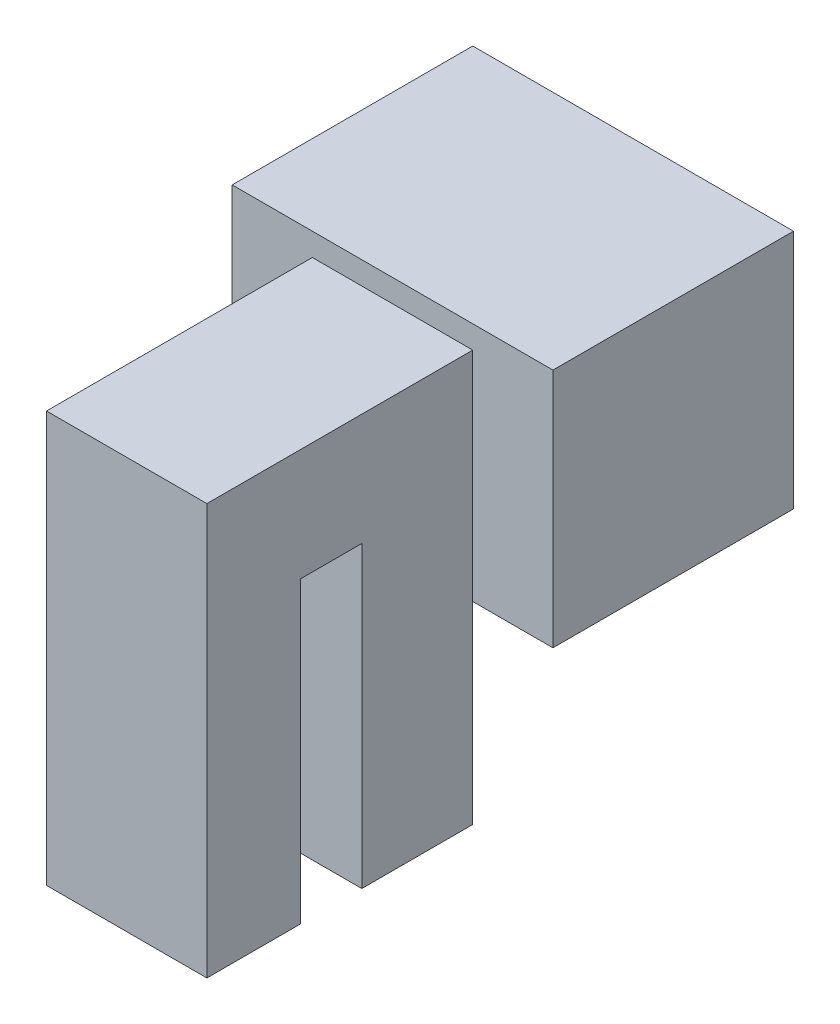
ISO-10303-21;
HEADER;
FILE_DESCRIPTION(('STEP AP214'),'2;1');
FILE_NAME('part.step','',(''),(''),'','','');
FILE_SCHEMA(('AUTOMOTIVE_DESIGN { 1 0 10303 214 1 1 1 1 }'));
ENDSEC;
DATA;
#1=APPLICATION_CONTEXT('core data for automotive mechanical design processes');
#2=APPLICATION_PROTOCOL_DEFINITION('international standard','automotive_design',2000,#1);
#3=PRODUCT_CONTEXT('',#1,'mechanical');
#4=PRODUCT('Part','Part','',(#3));
#5=PRODUCT_RELATED_PRODUCT_CATEGORY('part','',(#4));
#6=PRODUCT_DEFINITION_FORMATION('','',#4);
#7=PRODUCT_DEFINITION_CONTEXT('part definition',#1,'design');
#8=PRODUCT_DEFINITION('design','',#6,#7);
#9=PRODUCT_DEFINITION_SHAPE('','',#8);
#10=(LENGTH_UNIT() NAMED_UNIT(*) SI_UNIT(.MILLI.,.METRE.));
#11=(NAMED_UNIT(*) PLANE_ANGLE_UNIT() SI_UNIT($,.RADIAN.));
#12=(NAMED_UNIT(*) SI_UNIT($,.STERADIAN.) SOLID_ANGLE_UNIT());
#13=UNCERTAINTY_MEASURE_WITH_UNIT(LENGTH_MEASURE(1.E-05),#10,'distance_accuracy_value','');
#14=(GEOMETRIC_REPRESENTATION_CONTEXT(3) GLOBAL_UNCERTAINTY_ASSIGNED_CONTEXT((#13)) GLOBAL_UNIT_ASSIGNED_CONTEXT((#10,
#11,#12)) REPRESENTATION_CONTEXT('',''));
#15=CARTESIAN_POINT('',(0.,0.,0.));
#16=DIRECTION('',(0.,0.,1.));
#17=DIRECTION('',(1.,0.,0.));
#18=AXIS2_PLACEMENT_3D('',#15,#16,#17);
#19=CARTESIAN_POINT('',(0.,0.,30.));
#20=DIRECTION('',(-1.,0.,0.));
#21=DIRECTION('',(0.,-1.,0.));
#22=AXIS2_PLACEMENT_3D('',#19,#20,#21);
#23=PLANE('',#22);
#24=DIRECTION('',(0.,1.,0.));
#25=VECTOR('',#24,1.);
#26=CARTESIAN_POINT('',(0.,0.,0.));
#27=LINE('',#26,#25);
#28=CARTESIAN_POINT('',(0.,0.,0.));
#29=VERTEX_POINT('',#28);
#30=CARTESIAN_POINT('',(0.,30.,0.));
#31=VERTEX_POINT('',#30);
#32=EDGE_CURVE('E200',#29,#31,#27,.T.);
#33=ORIENTED_EDGE('',*,*,#32,.T.);
#34=DIRECTION('',(0.,0.,-1.));
#35=VECTOR('',#34,1.);
#36=CARTESIAN_POINT('',(0.,30.,30.));
#37=LINE('',#36,#35);
#38=CARTESIAN_POINT('',(0.,30.,30.));
#39=VERTEX_POINT('',#38);
#40=EDGE_CURVE('E11',#39,#31,#37,.T.);
#41=ORIENTED_EDGE('',*,*,#40,.F.);
#42=DIRECTION('',(0.,1.,0.));
#43=VECTOR('',#42,1.);
#44=CARTESIAN_POINT('',(0.,0.,30.));
#45=LINE('',#44,#43);
#46=CARTESIAN_POINT('',(0.,0.,30.));
#47=VERTEX_POINT('',#46);
#48=EDGE_CURVE('E212',#47,#39,#45,.T.);
#49=ORIENTED_EDGE('',*,*,#48,.F.);
#50=DIRECTION('',(0.,0.,-1.));
#51=VECTOR('',#50,1.);
#52=CARTESIAN_POINT('',(0.,0.,30.));
#53=LINE('',#52,#51);
#54=EDGE_CURVE('E220',#47,#29,#53,.T.);
#55=ORIENTED_EDGE('',*,*,#54,.T.);
#56=EDGE_LOOP('',(#33,#41,#49,#55));
#57=FACE_BOUND('',#56,.T.);
#58=ADVANCED_FACE('F33',(#57),#23,.F.);
#59=CARTESIAN_POINT('',(0.,30.,30.));
#60=DIRECTION('',(0.,-1.,0.));
#61=DIRECTION('',(1.,0.,0.));
#62=AXIS2_PLACEMENT_3D('',#59,#60,#61);
#63=PLANE('',#62);
#64=DIRECTION('',(-1.,0.,0.));
#65=VECTOR('',#64,1.);
#66=CARTESIAN_POINT('',(0.,30.,0.));
#67=LINE('',#66,#65);
#68=CARTESIAN_POINT('',(-40.,30.,0.));
#69=VERTEX_POINT('',#68);
#70=EDGE_CURVE('E223',#31,#69,#67,.T.);
#71=ORIENTED_EDGE('',*,*,#70,.T.);
#72=DIRECTION('',(0.,0.,-1.));
#73=VECTOR('',#72,1.);
#74=CARTESIAN_POINT('',(-40.,30.,30.));
#75=LINE('',#74,#73);
#76=CARTESIAN_POINT('',(-40.,30.,30.));
#77=VERTEX_POINT('',#76);
#78=EDGE_CURVE('E40',#77,#69,#75,.T.);
#79=ORIENTED_EDGE('',*,*,#78,.F.);
#80=DIRECTION('',(-1.,0.,0.));
#81=VECTOR('',#80,1.);
#82=CARTESIAN_POINT('',(0.,30.,30.));
#83=LINE('',#82,#81);
#84=EDGE_CURVE('E85',#39,#77,#83,.T.);
#85=ORIENTED_EDGE('',*,*,#84,.F.);
#86=ORIENTED_EDGE('',*,*,#40,.T.);
#87=EDGE_LOOP('',(#71,#79,#85,#86));
#88=FACE_BOUND('',#87,.T.);
#89=ADVANCED_FACE('F279',(#88),#63,.F.);
#90=CARTESIAN_POINT('',(-40.,0.,30.));
#91=DIRECTION('',(1.,0.,0.));
#92=DIRECTION('',(0.,0.,-1.));
#93=AXIS2_PLACEMENT_3D('',#90,#91,#92);
#94=PLANE('',#93);
#95=DIRECTION('',(0.,-1.,0.));
#96=VECTOR('',#95,1.);
#97=CARTESIAN_POINT('',(-40.,0.,0.));
#98=LINE('',#97,#96);
#99=CARTESIAN_POINT('',(-40.,0.,0.));
#100=VERTEX_POINT('',#99);
#101=EDGE_CURVE('E225',#69,#100,#98,.T.);
#102=ORIENTED_EDGE('',*,*,#101,.T.);
#103=DIRECTION('',(0.,0.,-1.));
#104=VECTOR('',#103,1.);
#105=CARTESIAN_POINT('',(-40.,0.,30.));
#106=LINE('',#105,#104);
#107=CARTESIAN_POINT('',(-40.,0.,30.));
#108=VERTEX_POINT('',#107);
#109=EDGE_CURVE('E229',#108,#100,#106,.T.);
#110=ORIENTED_EDGE('',*,*,#109,.F.);
#111=DIRECTION('',(0.,-1.,0.));
#112=VECTOR('',#111,1.);
#113=CARTESIAN_POINT('',(-40.,0.,30.));
#114=LINE('',#113,#112);
#115=EDGE_CURVE('E215',#77,#108,#114,.T.);
#116=ORIENTED_EDGE('',*,*,#115,.F.);
#117=ORIENTED_EDGE('',*,*,#78,.T.);
#118=EDGE_LOOP('',(#102,#110,#116,#117));
#119=FACE_BOUND('',#118,.T.);
#120=ADVANCED_FACE('F234',(#119),#94,.F.);
#121=CARTESIAN_POINT('',(0.,0.,30.));
#122=DIRECTION('',(0.,1.,0.));
#123=DIRECTION('',(-1.,0.,0.));
#124=AXIS2_PLACEMENT_3D('',#121,#122,#123);
#125=PLANE('',#124);
#126=DIRECTION('',(1.,0.,0.));
#127=VECTOR('',#126,1.);
#128=CARTESIAN_POINT('',(0.,0.,0.));
#129=LINE('',#128,#127);
#130=EDGE_CURVE('E78',#100,#29,#129,.T.);
#131=ORIENTED_EDGE('',*,*,#130,.T.);
#132=ORIENTED_EDGE('',*,*,#54,.F.);
#133=DIRECTION('',(1.,0.,0.));
#134=VECTOR('',#133,1.);
#135=CARTESIAN_POINT('',(0.,0.,30.));
#136=LINE('',#135,#134);
#137=CARTESIAN_POINT('',(-10.,0.,30.));
#138=VERTEX_POINT('',#137);
#139=EDGE_CURVE('E56',#138,#47,#136,.T.);
#140=ORIENTED_EDGE('',*,*,#139,.F.);
#141=CARTESIAN_POINT('',(-30.,0.,30.));
#142=VERTEX_POINT('',#141);
#143=EDGE_CURVE('E141',#142,#138,#136,.T.);
#144=ORIENTED_EDGE('',*,*,#143,.F.);
#145=EDGE_CURVE('E217',#108,#142,#136,.T.);
#146=ORIENTED_EDGE('',*,*,#145,.F.);
#147=ORIENTED_EDGE('',*,*,#109,.T.);
#148=EDGE_LOOP('',(#131,#132,#140,#144,#146,#147));
#149=FACE_BOUND('',#148,.T.);
#150=ADVANCED_FACE('F242',(#149),#125,.F.);
#151=CARTESIAN_POINT('',(0.,0.,30.));
#152=DIRECTION('',(0.,0.,1.));
#153=DIRECTION('',(1.,0.,0.));
#154=AXIS2_PLACEMENT_3D('',#151,#152,#153);
#155=PLANE('',#154);
#156=DIRECTION('',(0.,-1.,0.));
#157=VECTOR('',#156,1.);
#158=CARTESIAN_POINT('',(-30.,27.1581703390217,30.));
#159=LINE('',#158,#157);
#160=CARTESIAN_POINT('',(-30.,27.1581703390217,30.));
#161=VERTEX_POINT('',#160);
#162=EDGE_CURVE('E176',#161,#142,#159,.T.);
#163=ORIENTED_EDGE('',*,*,#162,.F.);
#164=DIRECTION('',(-1.,0.,0.));
#165=VECTOR('',#164,1.);
#166=CARTESIAN_POINT('',(-10.,27.1581703390217,30.));
#167=LINE('',#166,#165);
#168=CARTESIAN_POINT('',(-10.,27.1581703390217,30.));
#169=VERTEX_POINT('',#168);
#170=EDGE_CURVE('E198',#169,#161,#167,.T.);
#171=ORIENTED_EDGE('',*,*,#170,.F.);
#172=DIRECTION('',(0.,-1.,0.));
#173=VECTOR('',#172,1.);
#174=CARTESIAN_POINT('',(-10.,27.1581703390217,30.));
#175=LINE('',#174,#173);
#176=EDGE_CURVE('E142',#169,#138,#175,.T.);
#177=ORIENTED_EDGE('',*,*,#176,.T.);
#178=ORIENTED_EDGE('',*,*,#139,.T.);
#179=ORIENTED_EDGE('',*,*,#48,.T.);
#180=ORIENTED_EDGE('',*,*,#84,.T.);
#181=ORIENTED_EDGE('',*,*,#115,.T.);
#182=ORIENTED_EDGE('',*,*,#145,.T.);
#183=EDGE_LOOP('',(#163,#171,#177,#178,#179,#180,#181,#182));
#184=FACE_BOUND('',#183,.T.);
#185=ADVANCED_FACE('F245',(#184),#155,.T.);
#186=CARTESIAN_POINT('',(0.,0.,0.));
#187=DIRECTION('',(0.,0.,1.));
#188=DIRECTION('',(1.,0.,0.));
#189=AXIS2_PLACEMENT_3D('',#186,#187,#188);
#190=PLANE('',#189);
#191=ORIENTED_EDGE('',*,*,#32,.F.);
#192=ORIENTED_EDGE('',*,*,#130,.F.);
#193=ORIENTED_EDGE('',*,*,#101,.F.);
#194=ORIENTED_EDGE('',*,*,#70,.F.);
#195=EDGE_LOOP('',(#191,#192,#193,#194));
#196=FACE_BOUND('',#195,.T.);
#197=ADVANCED_FACE('F238',(#196),#190,.F.);
#198=CARTESIAN_POINT('',(-10.,27.1581703390217,30.));
#199=DIRECTION('',(0.,0.,-1.));
#200=DIRECTION('',(-1.,0.,0.));
#201=AXIS2_PLACEMENT_3D('',#198,#199,#200);
#202=PLANE('',#201);
#203=CARTESIAN_POINT('',(-30.,-24.0798332325672,30.));
#204=VERTEX_POINT('',#203);
#205=EDGE_CURVE('E179',#142,#204,#159,.T.);
#206=ORIENTED_EDGE('',*,*,#205,.F.);
#207=ORIENTED_EDGE('',*,*,#143,.T.);
#208=CARTESIAN_POINT('',(-10.,-24.0798332325672,30.));
#209=VERTEX_POINT('',#208);
#210=EDGE_CURVE('E47',#138,#209,#175,.T.);
#211=ORIENTED_EDGE('',*,*,#210,.T.);
#212=DIRECTION('',(-1.,0.,0.));
#213=VECTOR('',#212,1.);
#214=CARTESIAN_POINT('',(-10.,-24.0798332325672,30.));
#215=LINE('',#214,#213);
#216=EDGE_CURVE('E138',#209,#204,#215,.T.);
#217=ORIENTED_EDGE('',*,*,#216,.T.);
#218=EDGE_LOOP('',(#206,#207,#211,#217));
#219=FACE_BOUND('',#218,.T.);
#220=ADVANCED_FACE('F137',(#219),#202,.T.);
#221=CARTESIAN_POINT('',(-10.,27.1581703390217,30.));
#222=DIRECTION('',(0.,1.,0.));
#223=DIRECTION('',(0.,0.,1.));
#224=AXIS2_PLACEMENT_3D('',#221,#222,#223);
#225=PLANE('',#224);
#226=DIRECTION('',(0.,0.,-1.));
#227=VECTOR('',#226,1.);
#228=CARTESIAN_POINT('',(-30.,27.1581703390217,30.));
#229=LINE('',#228,#227);
#230=CARTESIAN_POINT('',(-30.,27.1581703390217,63.1561933360463));
#231=VERTEX_POINT('',#230);
#232=EDGE_CURVE('E143',#231,#161,#229,.T.);
#233=ORIENTED_EDGE('',*,*,#232,.F.);
#234=DIRECTION('',(-1.,0.,0.));
#235=VECTOR('',#234,1.);
#236=CARTESIAN_POINT('',(-10.,27.1581703390217,63.1561933360463));
#237=LINE('',#236,#235);
#238=CARTESIAN_POINT('',(-10.,27.1581703390217,63.1561933360463));
#239=VERTEX_POINT('',#238);
#240=EDGE_CURVE('E201',#239,#231,#237,.T.);
#241=ORIENTED_EDGE('',*,*,#240,.F.);
#242=DIRECTION('',(0.,0.,-1.));
#243=VECTOR('',#242,1.);
#244=CARTESIAN_POINT('',(-10.,27.1581703390217,30.));
#245=LINE('',#244,#243);
#246=EDGE_CURVE('E152',#239,#169,#245,.T.);
#247=ORIENTED_EDGE('',*,*,#246,.T.);
#248=ORIENTED_EDGE('',*,*,#170,.T.);
#249=EDGE_LOOP('',(#233,#241,#247,#248));
#250=FACE_BOUND('',#249,.T.);
#251=ADVANCED_FACE('F252',(#250),#225,.T.);
#252=CARTESIAN_POINT('',(-10.,27.1581703390217,63.1561933360463));
#253=DIRECTION('',(0.,0.,1.));
#254=DIRECTION('',(1.,0.,0.));
#255=AXIS2_PLACEMENT_3D('',#252,#253,#254);
#256=PLANE('',#255);
#257=DIRECTION('',(0.,1.,0.));
#258=VECTOR('',#257,1.);
#259=CARTESIAN_POINT('',(-30.,27.1581703390217,63.1561933360463));
#260=LINE('',#259,#258);
#261=CARTESIAN_POINT('',(-30.,-24.0798332325672,63.1561933360463));
#262=VERTEX_POINT('',#261);
#263=EDGE_CURVE('E193',#262,#231,#260,.T.);
#264=ORIENTED_EDGE('',*,*,#263,.F.);
#265=DIRECTION('',(-1.,0.,0.));
#266=VECTOR('',#265,1.);
#267=CARTESIAN_POINT('',(-10.,-24.0798332325672,63.1561933360463));
#268=LINE('',#267,#266);
#269=CARTESIAN_POINT('',(-10.,-24.0798332325672,63.1561933360463));
#270=VERTEX_POINT('',#269);
#271=EDGE_CURVE('E203',#270,#262,#268,.T.);
#272=ORIENTED_EDGE('',*,*,#271,.F.);
#273=DIRECTION('',(0.,1.,0.));
#274=VECTOR('',#273,1.);
#275=CARTESIAN_POINT('',(-10.,27.1581703390217,63.1561933360463));
#276=LINE('',#275,#274);
#277=EDGE_CURVE('E171',#270,#239,#276,.T.);
#278=ORIENTED_EDGE('',*,*,#277,.T.);
#279=ORIENTED_EDGE('',*,*,#240,.T.);
#280=EDGE_LOOP('',(#264,#272,#278,#279));
#281=FACE_BOUND('',#280,.T.);
#282=ADVANCED_FACE('F298',(#281),#256,.T.);
#283=CARTESIAN_POINT('',(-10.,-24.0798332325672,51.5046134278178));
#284=DIRECTION('',(0.,-1.,0.));
#285=DIRECTION('',(0.,0.,-1.));
#286=AXIS2_PLACEMENT_3D('',#283,#284,#285);
#287=PLANE('',#286);
#288=DIRECTION('',(0.,0.,1.));
#289=VECTOR('',#288,1.);
#290=CARTESIAN_POINT('',(-30.,-24.0798332325672,51.5046134278178));
#291=LINE('',#290,#289);
#292=CARTESIAN_POINT('',(-30.,-24.0798332325672,51.5046134278178));
#293=VERTEX_POINT('',#292);
#294=EDGE_CURVE('E190',#293,#262,#291,.T.);
#295=ORIENTED_EDGE('',*,*,#294,.F.);
#296=DIRECTION('',(-1.,0.,0.));
#297=VECTOR('',#296,1.);
#298=CARTESIAN_POINT('',(-10.,-24.0798332325672,51.5046134278178));
#299=LINE('',#298,#297);
#300=CARTESIAN_POINT('',(-10.,-24.0798332325672,51.5046134278178));
#301=VERTEX_POINT('',#300);
#302=EDGE_CURVE('E205',#301,#293,#299,.T.);
#303=ORIENTED_EDGE('',*,*,#302,.F.);
#304=DIRECTION('',(0.,0.,1.));
#305=VECTOR('',#304,1.);
#306=CARTESIAN_POINT('',(-10.,-24.0798332325672,51.5046134278178));
#307=LINE('',#306,#305);
#308=EDGE_CURVE('E168',#301,#270,#307,.T.);
#309=ORIENTED_EDGE('',*,*,#308,.T.);
#310=ORIENTED_EDGE('',*,*,#271,.T.);
#311=EDGE_LOOP('',(#295,#303,#309,#310));
#312=FACE_BOUND('',#311,.T.);
#313=ADVANCED_FACE('F260',(#312),#287,.T.);
#314=CARTESIAN_POINT('',(-10.,-24.0798332325672,51.5046134278178));
#315=DIRECTION('',(0.,0.,-1.));
#316=DIRECTION('',(-1.,0.,0.));
#317=AXIS2_PLACEMENT_3D('',#314,#315,#316);
#318=PLANE('',#317);
#319=DIRECTION('',(0.,-1.,0.));
#320=VECTOR('',#319,1.);
#321=CARTESIAN_POINT('',(-30.,-24.0798332325672,51.5046134278178));
#322=LINE('',#321,#320);
#323=CARTESIAN_POINT('',(-30.,13.1907484614558,51.5046134278178));
#324=VERTEX_POINT('',#323);
#325=EDGE_CURVE('E187',#324,#293,#322,.T.);
#326=ORIENTED_EDGE('',*,*,#325,.F.);
#327=DIRECTION('',(-1.,0.,0.));
#328=VECTOR('',#327,1.);
#329=CARTESIAN_POINT('',(-10.,13.1907484614558,51.5046134278178));
#330=LINE('',#329,#328);
#331=CARTESIAN_POINT('',(-10.,13.1907484614558,51.5046134278178));
#332=VERTEX_POINT('',#331);
#333=EDGE_CURVE('E207',#332,#324,#330,.T.);
#334=ORIENTED_EDGE('',*,*,#333,.F.);
#335=DIRECTION('',(0.,-1.,0.));
#336=VECTOR('',#335,1.);
#337=CARTESIAN_POINT('',(-10.,-24.0798332325672,51.5046134278178));
#338=LINE('',#337,#336);
#339=EDGE_CURVE('E165',#332,#301,#338,.T.);
#340=ORIENTED_EDGE('',*,*,#339,.T.);
#341=ORIENTED_EDGE('',*,*,#302,.T.);
#342=EDGE_LOOP('',(#326,#334,#340,#341));
#343=FACE_BOUND('',#342,.T.);
#344=ADVANCED_FACE('F263',(#343),#318,.T.);
#345=CARTESIAN_POINT('',(-10.,13.1907484614558,43.8333869043878));
#346=DIRECTION('',(0.,-1.,0.));
#347=DIRECTION('',(0.,0.,-1.));
#348=AXIS2_PLACEMENT_3D('',#345,#346,#347);
#349=PLANE('',#348);
#350=DIRECTION('',(0.,0.,1.));
#351=VECTOR('',#350,1.);
#352=CARTESIAN_POINT('',(-30.,13.1907484614558,43.8333869043878));
#353=LINE('',#352,#351);
#354=CARTESIAN_POINT('',(-30.,13.1907484614558,43.8333869043878));
#355=VERTEX_POINT('',#354);
#356=EDGE_CURVE('E184',#355,#324,#353,.T.);
#357=ORIENTED_EDGE('',*,*,#356,.F.);
#358=DIRECTION('',(-1.,0.,0.));
#359=VECTOR('',#358,1.);
#360=CARTESIAN_POINT('',(-10.,13.1907484614558,43.8333869043878));
#361=LINE('',#360,#359);
#362=CARTESIAN_POINT('',(-10.,13.1907484614558,43.8333869043878));
#363=VERTEX_POINT('',#362);
#364=EDGE_CURVE('E209',#363,#355,#361,.T.);
#365=ORIENTED_EDGE('',*,*,#364,.F.);
#366=DIRECTION('',(0.,0.,1.));
#367=VECTOR('',#366,1.);
#368=CARTESIAN_POINT('',(-10.,13.1907484614558,43.8333869043878));
#369=LINE('',#368,#367);
#370=EDGE_CURVE('E160',#363,#332,#369,.T.);
#371=ORIENTED_EDGE('',*,*,#370,.T.);
#372=ORIENTED_EDGE('',*,*,#333,.T.);
#373=EDGE_LOOP('',(#357,#365,#371,#372));
#374=FACE_BOUND('',#373,.T.);
#375=ADVANCED_FACE('F266',(#374),#349,.T.);
#376=CARTESIAN_POINT('',(-10.,-24.0798332325672,43.8333869043878));
#377=DIRECTION('',(0.,0.,1.));
#378=DIRECTION('',(1.,0.,0.));
#379=AXIS2_PLACEMENT_3D('',#376,#377,#378);
#380=PLANE('',#379);
#381=DIRECTION('',(0.,1.,0.));
#382=VECTOR('',#381,1.);
#383=CARTESIAN_POINT('',(-30.,-24.0798332325672,43.8333869043878));
#384=LINE('',#383,#382);
#385=CARTESIAN_POINT('',(-30.,-24.0798332325672,43.8333869043878));
#386=VERTEX_POINT('',#385);
#387=EDGE_CURVE('E181',#386,#355,#384,.T.);
#388=ORIENTED_EDGE('',*,*,#387,.F.);
#389=DIRECTION('',(-1.,0.,0.));
#390=VECTOR('',#389,1.);
#391=CARTESIAN_POINT('',(-10.,-24.0798332325672,43.8333869043878));
#392=LINE('',#391,#390);
#393=CARTESIAN_POINT('',(-10.,-24.0798332325672,43.8333869043878));
#394=VERTEX_POINT('',#393);
#395=EDGE_CURVE('E151',#394,#386,#392,.T.);
#396=ORIENTED_EDGE('',*,*,#395,.F.);
#397=DIRECTION('',(0.,1.,0.));
#398=VECTOR('',#397,1.);
#399=CARTESIAN_POINT('',(-10.,-24.0798332325672,43.8333869043878));
#400=LINE('',#399,#398);
#401=EDGE_CURVE('E158',#394,#363,#400,.T.);
#402=ORIENTED_EDGE('',*,*,#401,.T.);
#403=ORIENTED_EDGE('',*,*,#364,.T.);
#404=EDGE_LOOP('',(#388,#396,#402,#403));
#405=FACE_BOUND('',#404,.T.);
#406=ADVANCED_FACE('F269',(#405),#380,.T.);
#407=CARTESIAN_POINT('',(-10.,-24.0798332325672,30.));
#408=DIRECTION('',(0.,-1.,0.));
#409=DIRECTION('',(0.,0.,-1.));
#410=AXIS2_PLACEMENT_3D('',#407,#408,#409);
#411=PLANE('',#410);
#412=DIRECTION('',(0.,0.,1.));
#413=VECTOR('',#412,1.);
#414=CARTESIAN_POINT('',(-30.,-24.0798332325672,30.));
#415=LINE('',#414,#413);
#416=EDGE_CURVE('E150',#204,#386,#415,.T.);
#417=ORIENTED_EDGE('',*,*,#416,.F.);
#418=ORIENTED_EDGE('',*,*,#216,.F.);
#419=DIRECTION('',(0.,0.,1.));
#420=VECTOR('',#419,1.);
#421=CARTESIAN_POINT('',(-10.,-24.0798332325672,30.));
#422=LINE('',#421,#420);
#423=EDGE_CURVE('E148',#209,#394,#422,.T.);
#424=ORIENTED_EDGE('',*,*,#423,.T.);
#425=ORIENTED_EDGE('',*,*,#395,.T.);
#426=EDGE_LOOP('',(#417,#418,#424,#425));
#427=FACE_BOUND('',#426,.T.);
#428=ADVANCED_FACE('F147',(#427),#411,.T.);
#429=CARTESIAN_POINT('',(-10.,0.,0.));
#430=DIRECTION('',(-1.,0.,0.));
#431=DIRECTION('',(0.,0.,1.));
#432=AXIS2_PLACEMENT_3D('',#429,#430,#431);
#433=PLANE('',#432);
#434=ORIENTED_EDGE('',*,*,#176,.F.);
#435=ORIENTED_EDGE('',*,*,#246,.F.);
#436=ORIENTED_EDGE('',*,*,#277,.F.);
#437=ORIENTED_EDGE('',*,*,#308,.F.);
#438=ORIENTED_EDGE('',*,*,#339,.F.);
#439=ORIENTED_EDGE('',*,*,#370,.F.);
#440=ORIENTED_EDGE('',*,*,#401,.F.);
#441=ORIENTED_EDGE('',*,*,#423,.F.);
#442=ORIENTED_EDGE('',*,*,#210,.F.);
#443=EDGE_LOOP('',(#434,#435,#436,#437,#438,#439,#440,#441,#442));
#444=FACE_BOUND('',#443,.T.);
#445=ADVANCED_FACE('F155',(#444),#433,.F.);
#446=CARTESIAN_POINT('',(-30.,0.,0.));
#447=DIRECTION('',(-1.,0.,0.));
#448=DIRECTION('',(0.,0.,1.));
#449=AXIS2_PLACEMENT_3D('',#446,#447,#448);
#450=PLANE('',#449);
#451=ORIENTED_EDGE('',*,*,#162,.T.);
#452=ORIENTED_EDGE('',*,*,#205,.T.);
#453=ORIENTED_EDGE('',*,*,#416,.T.);
#454=ORIENTED_EDGE('',*,*,#387,.T.);
#455=ORIENTED_EDGE('',*,*,#356,.T.);
#456=ORIENTED_EDGE('',*,*,#325,.T.);
#457=ORIENTED_EDGE('',*,*,#294,.T.);
#458=ORIENTED_EDGE('',*,*,#263,.T.);
#459=ORIENTED_EDGE('',*,*,#232,.T.);
#460=EDGE_LOOP('',(#451,#452,#453,#454,#455,#456,#457,#458,#459));
#461=FACE_BOUND('',#460,.T.);
#462=ADVANCED_FACE('F248',(#461),#450,.T.);
#463=CLOSED_SHELL('',(#58,#89,#120,#150,#185,#197,#220,#251,#282,#313,#344,#375,#406,#428,#445,#462));
#464=MANIFOLD_SOLID_BREP('B2',#463);
#465=ADVANCED_BREP_SHAPE_REPRESENTATION('',(#18,#464),#14);
#466=SHAPE_DEFINITION_REPRESENTATION(#9,#465);
ENDSEC;
END-ISO-10303-21;
